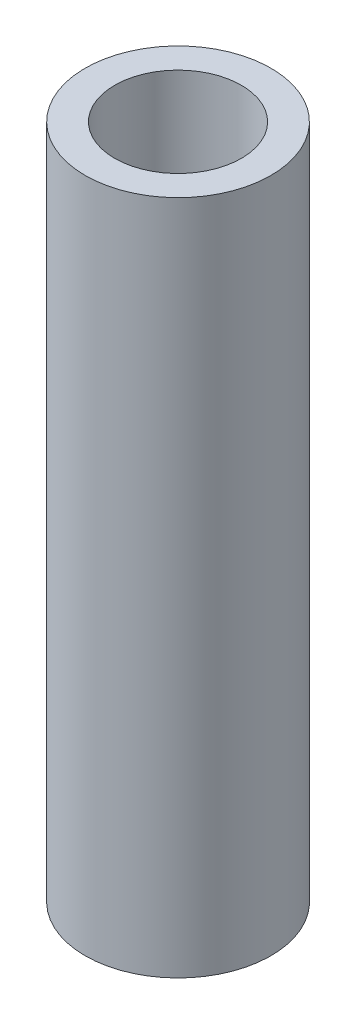
ISO-10303-21;
HEADER;
FILE_DESCRIPTION(('STEP AP214'),'2;1');
FILE_NAME('part.step','',(''),(''),'','','');
FILE_SCHEMA(('AUTOMOTIVE_DESIGN { 1 0 10303 214 1 1 1 1 }'));
ENDSEC;
DATA;
#1=APPLICATION_CONTEXT('core data for automotive mechanical design processes');
#2=APPLICATION_PROTOCOL_DEFINITION('international standard','automotive_design',2000,#1);
#3=PRODUCT_CONTEXT('',#1,'mechanical');
#4=PRODUCT('Part','Part','',(#3));
#5=PRODUCT_RELATED_PRODUCT_CATEGORY('part','',(#4));
#6=PRODUCT_DEFINITION_FORMATION('','',#4);
#7=PRODUCT_DEFINITION_CONTEXT('part definition',#1,'design');
#8=PRODUCT_DEFINITION('design','',#6,#7);
#9=PRODUCT_DEFINITION_SHAPE('','',#8);
#10=(LENGTH_UNIT() NAMED_UNIT(*) SI_UNIT(.MILLI.,.METRE.));
#11=(NAMED_UNIT(*) PLANE_ANGLE_UNIT() SI_UNIT($,.RADIAN.));
#12=(NAMED_UNIT(*) SI_UNIT($,.STERADIAN.) SOLID_ANGLE_UNIT());
#13=UNCERTAINTY_MEASURE_WITH_UNIT(LENGTH_MEASURE(1.E-05),#10,'distance_accuracy_value','');
#14=(GEOMETRIC_REPRESENTATION_CONTEXT(3) GLOBAL_UNCERTAINTY_ASSIGNED_CONTEXT((#13)) GLOBAL_UNIT_ASSIGNED_CONTEXT((#10,
#11,#12)) REPRESENTATION_CONTEXT('',''));
#15=CARTESIAN_POINT('',(0.,0.,0.));
#16=DIRECTION('',(0.,0.,1.));
#17=DIRECTION('',(1.,0.,0.));
#18=AXIS2_PLACEMENT_3D('',#15,#16,#17);
#19=CARTESIAN_POINT('',(0.,80.,0.));
#20=DIRECTION('',(0.,1.,0.));
#21=DIRECTION('',(0.,0.,1.));
#22=AXIS2_PLACEMENT_3D('',#19,#20,#21);
#23=PLANE('',#22);
#24=CARTESIAN_POINT('',(0.,80.,0.));
#25=DIRECTION('',(0.,1.,0.));
#26=DIRECTION('',(0.,0.,1.));
#27=AXIS2_PLACEMENT_3D('',#24,#25,#26);
#28=CIRCLE('',#27,11.);
#29=CARTESIAN_POINT('',(0.,80.,11.));
#30=VERTEX_POINT('',#29);
#31=EDGE_CURVE('E10',#30,#30,#28,.T.);
#32=ORIENTED_EDGE('',*,*,#31,.T.);
#33=EDGE_LOOP('',(#32));
#34=FACE_BOUND('',#33,.T.);
#35=CARTESIAN_POINT('',(0.,80.,0.));
#36=DIRECTION('',(0.,1.,0.));
#37=DIRECTION('',(0.,0.,1.));
#38=AXIS2_PLACEMENT_3D('',#35,#36,#37);
#39=CIRCLE('',#38,7.5);
#40=CARTESIAN_POINT('',(0.,80.,7.5));
#41=VERTEX_POINT('',#40);
#42=EDGE_CURVE('E50',#41,#41,#39,.T.);
#43=ORIENTED_EDGE('',*,*,#42,.F.);
#44=EDGE_LOOP('',(#43));
#45=FACE_BOUND('',#44,.T.);
#46=ADVANCED_FACE('F37',(#34,#45),#23,.T.);
#47=CARTESIAN_POINT('',(0.,0.,0.));
#48=DIRECTION('',(0.,1.,0.));
#49=DIRECTION('',(0.,0.,1.));
#50=AXIS2_PLACEMENT_3D('',#47,#48,#49);
#51=PLANE('',#50);
#52=CARTESIAN_POINT('',(0.,0.,0.));
#53=DIRECTION('',(0.,1.,0.));
#54=DIRECTION('',(0.,0.,1.));
#55=AXIS2_PLACEMENT_3D('',#52,#53,#54);
#56=CIRCLE('',#55,11.);
#57=CARTESIAN_POINT('',(0.,0.,11.));
#58=VERTEX_POINT('',#57);
#59=EDGE_CURVE('E41',#58,#58,#56,.T.);
#60=ORIENTED_EDGE('',*,*,#59,.F.);
#61=EDGE_LOOP('',(#60));
#62=FACE_BOUND('',#61,.T.);
#63=CARTESIAN_POINT('',(0.,0.,0.));
#64=DIRECTION('',(0.,1.,0.));
#65=DIRECTION('',(0.,0.,1.));
#66=AXIS2_PLACEMENT_3D('',#63,#64,#65);
#67=CIRCLE('',#66,7.5);
#68=CARTESIAN_POINT('',(0.,0.,7.5));
#69=VERTEX_POINT('',#68);
#70=EDGE_CURVE('E52',#69,#69,#67,.T.);
#71=ORIENTED_EDGE('',*,*,#70,.T.);
#72=EDGE_LOOP('',(#71));
#73=FACE_BOUND('',#72,.T.);
#74=ADVANCED_FACE('F64',(#62,#73),#51,.F.);
#75=CARTESIAN_POINT('',(0.,80.,0.));
#76=DIRECTION('',(0.,-1.,0.));
#77=DIRECTION('',(0.,0.,-1.));
#78=AXIS2_PLACEMENT_3D('',#75,#76,#77);
#79=CYLINDRICAL_SURFACE('',#78,11.);
#80=ORIENTED_EDGE('',*,*,#31,.F.);
#81=EDGE_LOOP('',(#80));
#82=FACE_BOUND('',#81,.T.);
#83=ORIENTED_EDGE('',*,*,#59,.T.);
#84=EDGE_LOOP('',(#83));
#85=FACE_BOUND('',#84,.T.);
#86=ADVANCED_FACE('F39',(#82,#85),#79,.T.);
#87=CARTESIAN_POINT('',(0.,80.,0.));
#88=DIRECTION('',(0.,-1.,0.));
#89=DIRECTION('',(0.,0.,-1.));
#90=AXIS2_PLACEMENT_3D('',#87,#88,#89);
#91=CYLINDRICAL_SURFACE('',#90,7.5);
#92=ORIENTED_EDGE('',*,*,#42,.T.);
#93=EDGE_LOOP('',(#92));
#94=FACE_BOUND('',#93,.T.);
#95=ORIENTED_EDGE('',*,*,#70,.F.);
#96=EDGE_LOOP('',(#95));
#97=FACE_BOUND('',#96,.T.);
#98=ADVANCED_FACE('F60',(#94,#97),#91,.F.);
#99=CLOSED_SHELL('',(#46,#74,#86,#98));
#100=MANIFOLD_SOLID_BREP('B2',#99);
#101=ADVANCED_BREP_SHAPE_REPRESENTATION('',(#18,#100),#14);
#102=SHAPE_DEFINITION_REPRESENTATION(#9,#101);
ENDSEC;
END-ISO-10303-21;
